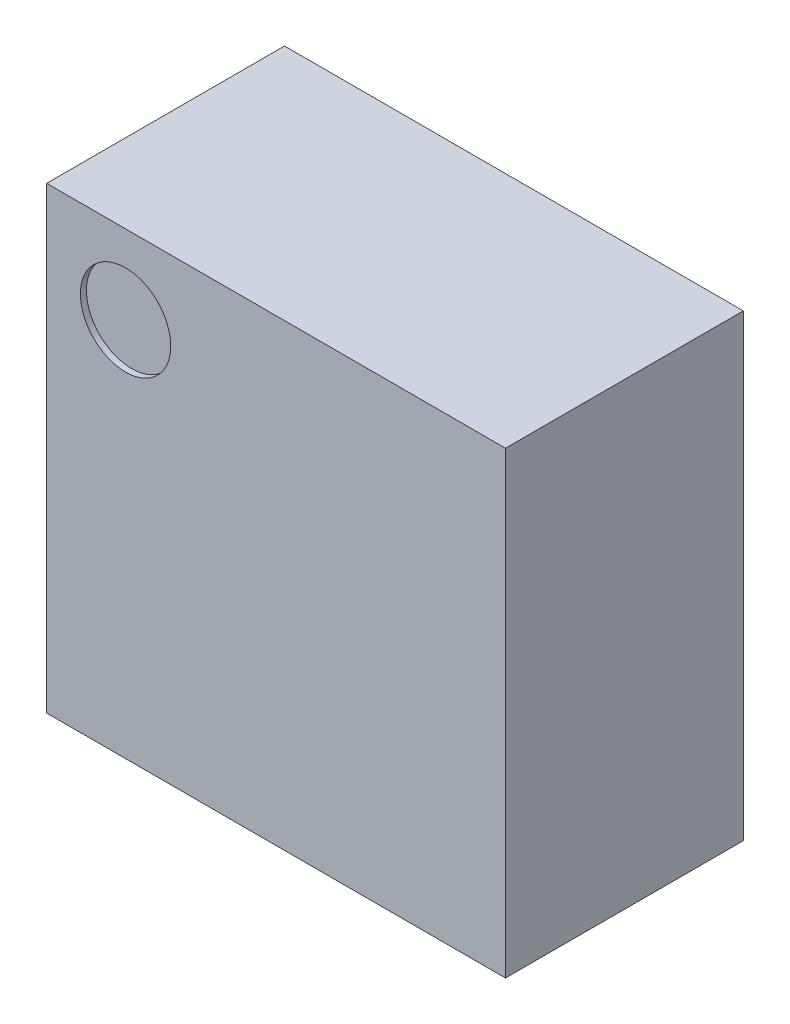
ISO-10303-21;
HEADER;
FILE_DESCRIPTION(('STEP AP214'),'2;1');
FILE_NAME('part.step','',(''),(''),'','','');
FILE_SCHEMA(('AUTOMOTIVE_DESIGN { 1 0 10303 214 1 1 1 1 }'));
ENDSEC;
DATA;
#1=APPLICATION_CONTEXT('core data for automotive mechanical design processes');
#2=APPLICATION_PROTOCOL_DEFINITION('international standard','automotive_design',2000,#1);
#3=PRODUCT_CONTEXT('',#1,'mechanical');
#4=PRODUCT('Part','Part','',(#3));
#5=PRODUCT_RELATED_PRODUCT_CATEGORY('part','',(#4));
#6=PRODUCT_DEFINITION_FORMATION('','',#4);
#7=PRODUCT_DEFINITION_CONTEXT('part definition',#1,'design');
#8=PRODUCT_DEFINITION('design','',#6,#7);
#9=PRODUCT_DEFINITION_SHAPE('','',#8);
#10=(LENGTH_UNIT() NAMED_UNIT(*) SI_UNIT(.MILLI.,.METRE.));
#11=(NAMED_UNIT(*) PLANE_ANGLE_UNIT() SI_UNIT($,.RADIAN.));
#12=(NAMED_UNIT(*) SI_UNIT($,.STERADIAN.) SOLID_ANGLE_UNIT());
#13=UNCERTAINTY_MEASURE_WITH_UNIT(LENGTH_MEASURE(1.E-05),#10,'distance_accuracy_value','');
#14=(GEOMETRIC_REPRESENTATION_CONTEXT(3) GLOBAL_UNCERTAINTY_ASSIGNED_CONTEXT((#13)) GLOBAL_UNIT_ASSIGNED_CONTEXT((#10,
#11,#12)) REPRESENTATION_CONTEXT('',''));
#15=CARTESIAN_POINT('',(0.,0.,0.));
#16=DIRECTION('',(0.,0.,1.));
#17=DIRECTION('',(1.,0.,0.));
#18=AXIS2_PLACEMENT_3D('',#15,#16,#17);
#19=CARTESIAN_POINT('',(0.,0.,0.53875000000102));
#20=DIRECTION('',(0.,0.,1.));
#21=DIRECTION('',(1.,0.,0.));
#22=AXIS2_PLACEMENT_3D('',#19,#20,#21);
#23=PLANE('',#22);
#24=CARTESIAN_POINT('',(-0.249999999999991,0.249999999999991,0.53875000000102));
#25=DIRECTION('',(0.,0.,1.));
#26=DIRECTION('',(1.,0.,0.));
#27=AXIS2_PLACEMENT_3D('',#24,#25,#26);
#28=CIRCLE('',#27,0.0750000000000048);
#29=CARTESIAN_POINT('',(-0.174999999999986,0.249999999999991,0.53875000000102));
#30=VERTEX_POINT('',#29);
#31=EDGE_CURVE('E20',#30,#30,#28,.T.);
#32=ORIENTED_EDGE('',*,*,#31,.T.);
#33=EDGE_LOOP('',(#32));
#34=FACE_BOUND('',#33,.T.);
#35=ADVANCED_FACE('F17',(#34),#23,.T.);
#36=CARTESIAN_POINT('',(-0.249999999999991,0.249999999999991,0.54875000000098));
#37=DIRECTION('',(0.,0.,1.));
#38=DIRECTION('',(1.,0.,0.));
#39=AXIS2_PLACEMENT_3D('',#36,#37,#38);
#40=CYLINDRICAL_SURFACE('',#39,0.0750000000000048);
#41=ORIENTED_EDGE('',*,*,#31,.F.);
#42=EDGE_LOOP('',(#41));
#43=FACE_BOUND('',#42,.T.);
#44=CARTESIAN_POINT('',(-0.249999999999991,0.249999999999991,0.54875000000098));
#45=DIRECTION('',(0.,0.,1.));
#46=DIRECTION('',(1.,0.,0.));
#47=AXIS2_PLACEMENT_3D('',#44,#45,#46);
#48=CIRCLE('',#47,0.0750000000000048);
#49=CARTESIAN_POINT('',(-0.174999999999986,0.249999999999991,0.54875000000098));
#50=VERTEX_POINT('',#49);
#51=EDGE_CURVE('E75',#50,#50,#48,.F.);
#52=ORIENTED_EDGE('',*,*,#51,.F.);
#53=EDGE_LOOP('',(#52));
#54=FACE_BOUND('',#53,.T.);
#55=ADVANCED_FACE('F90',(#43,#54),#40,.F.);
#56=CARTESIAN_POINT('',(0.,0.,0.54875000000098));
#57=DIRECTION('',(0.,0.,1.));
#58=DIRECTION('',(1.,0.,0.));
#59=AXIS2_PLACEMENT_3D('',#56,#57,#58);
#60=PLANE('',#59);
#61=ORIENTED_EDGE('',*,*,#51,.T.);
#62=EDGE_LOOP('',(#61));
#63=FACE_BOUND('',#62,.T.);
#64=DIRECTION('',(1.,0.,0.));
#65=VECTOR('',#64,1.);
#66=CARTESIAN_POINT('',(0.381,0.381,0.54875000000098));
#67=LINE('',#66,#65);
#68=CARTESIAN_POINT('',(-0.381,0.381,0.54875000000098));
#69=VERTEX_POINT('',#68);
#70=CARTESIAN_POINT('',(0.381,0.381,0.54875000000098));
#71=VERTEX_POINT('',#70);
#72=EDGE_CURVE('E71',#69,#71,#67,.T.);
#73=ORIENTED_EDGE('',*,*,#72,.F.);
#74=DIRECTION('',(0.,1.,0.));
#75=VECTOR('',#74,1.);
#76=CARTESIAN_POINT('',(-0.381,0.381,0.54875000000098));
#77=LINE('',#76,#75);
#78=CARTESIAN_POINT('',(-0.381,-0.381,0.54875000000098));
#79=VERTEX_POINT('',#78);
#80=EDGE_CURVE('E67',#79,#69,#77,.T.);
#81=ORIENTED_EDGE('',*,*,#80,.F.);
#82=DIRECTION('',(1.,0.,0.));
#83=VECTOR('',#82,1.);
#84=CARTESIAN_POINT('',(-0.381,-0.381,0.54875000000098));
#85=LINE('',#84,#83);
#86=CARTESIAN_POINT('',(0.381,-0.381,0.54875000000098));
#87=VERTEX_POINT('',#86);
#88=EDGE_CURVE('E58',#87,#79,#85,.F.);
#89=ORIENTED_EDGE('',*,*,#88,.F.);
#90=DIRECTION('',(0.,1.,0.));
#91=VECTOR('',#90,1.);
#92=CARTESIAN_POINT('',(0.381,-0.381,0.54875000000098));
#93=LINE('',#92,#91);
#94=EDGE_CURVE('E53',#71,#87,#93,.F.);
#95=ORIENTED_EDGE('',*,*,#94,.F.);
#96=EDGE_LOOP('',(#73,#81,#89,#95));
#97=FACE_BOUND('',#96,.T.);
#98=ADVANCED_FACE('F70',(#63,#97),#60,.T.);
#99=CARTESIAN_POINT('',(-0.381,0.381,0.));
#100=DIRECTION('',(-1.,0.,0.));
#101=DIRECTION('',(0.,0.,1.));
#102=AXIS2_PLACEMENT_3D('',#99,#100,#101);
#103=PLANE('',#102);
#104=DIRECTION('',(0.,0.,1.));
#105=VECTOR('',#104,1.);
#106=CARTESIAN_POINT('',(-0.381,0.381,0.));
#107=LINE('',#106,#105);
#108=CARTESIAN_POINT('',(-0.381,0.381,0.15375000000002));
#109=VERTEX_POINT('',#108);
#110=EDGE_CURVE('E186',#109,#69,#107,.T.);
#111=ORIENTED_EDGE('',*,*,#110,.F.);
#112=DIRECTION('',(0.,1.,0.));
#113=VECTOR('',#112,1.);
#114=CARTESIAN_POINT('',(-0.381,0.,0.15375000000002));
#115=LINE('',#114,#113);
#116=CARTESIAN_POINT('',(-0.381,-0.381,0.15375000000002));
#117=VERTEX_POINT('',#116);
#118=EDGE_CURVE('E79',#109,#117,#115,.F.);
#119=ORIENTED_EDGE('',*,*,#118,.T.);
#120=DIRECTION('',(0.,0.,-1.));
#121=VECTOR('',#120,1.);
#122=CARTESIAN_POINT('',(-0.381,-0.381,0.));
#123=LINE('',#122,#121);
#124=EDGE_CURVE('E63',#79,#117,#123,.T.);
#125=ORIENTED_EDGE('',*,*,#124,.F.);
#126=ORIENTED_EDGE('',*,*,#80,.T.);
#127=EDGE_LOOP('',(#111,#119,#125,#126));
#128=FACE_BOUND('',#127,.T.);
#129=ADVANCED_FACE('F78',(#128),#103,.T.);
#130=CARTESIAN_POINT('',(-0.381,-0.381,0.));
#131=DIRECTION('',(0.,-1.,0.));
#132=DIRECTION('',(0.,0.,-1.));
#133=AXIS2_PLACEMENT_3D('',#130,#131,#132);
#134=PLANE('',#133);
#135=ORIENTED_EDGE('',*,*,#124,.T.);
#136=DIRECTION('',(1.,0.,0.));
#137=VECTOR('',#136,1.);
#138=CARTESIAN_POINT('',(0.,-0.381,0.15375000000002));
#139=LINE('',#138,#137);
#140=CARTESIAN_POINT('',(0.381,-0.381,0.15375000000002));
#141=VERTEX_POINT('',#140);
#142=EDGE_CURVE('E187',#117,#141,#139,.T.);
#143=ORIENTED_EDGE('',*,*,#142,.T.);
#144=DIRECTION('',(0.,0.,-1.));
#145=VECTOR('',#144,1.);
#146=CARTESIAN_POINT('',(0.381,-0.381,0.));
#147=LINE('',#146,#145);
#148=EDGE_CURVE('E65',#87,#141,#147,.T.);
#149=ORIENTED_EDGE('',*,*,#148,.F.);
#150=ORIENTED_EDGE('',*,*,#88,.T.);
#151=EDGE_LOOP('',(#135,#143,#149,#150));
#152=FACE_BOUND('',#151,.T.);
#153=ADVANCED_FACE('F60',(#152),#134,.T.);
#154=CARTESIAN_POINT('',(0.381,-0.381,0.));
#155=DIRECTION('',(1.,0.,0.));
#156=DIRECTION('',(0.,0.,-1.));
#157=AXIS2_PLACEMENT_3D('',#154,#155,#156);
#158=PLANE('',#157);
#159=ORIENTED_EDGE('',*,*,#148,.T.);
#160=DIRECTION('',(0.,1.,0.));
#161=VECTOR('',#160,1.);
#162=CARTESIAN_POINT('',(0.381,0.,0.15375000000002));
#163=LINE('',#162,#161);
#164=CARTESIAN_POINT('',(0.381,0.381,0.15375000000002));
#165=VERTEX_POINT('',#164);
#166=EDGE_CURVE('E26',#141,#165,#163,.T.);
#167=ORIENTED_EDGE('',*,*,#166,.T.);
#168=DIRECTION('',(0.,0.,1.));
#169=VECTOR('',#168,1.);
#170=CARTESIAN_POINT('',(0.381,0.381,0.));
#171=LINE('',#170,#169);
#172=EDGE_CURVE('E34',#71,#165,#171,.F.);
#173=ORIENTED_EDGE('',*,*,#172,.F.);
#174=ORIENTED_EDGE('',*,*,#94,.T.);
#175=EDGE_LOOP('',(#159,#167,#173,#174));
#176=FACE_BOUND('',#175,.T.);
#177=ADVANCED_FACE('F107',(#176),#158,.T.);
#178=CARTESIAN_POINT('',(0.381,0.381,0.));
#179=DIRECTION('',(0.,1.,0.));
#180=DIRECTION('',(0.,0.,1.));
#181=AXIS2_PLACEMENT_3D('',#178,#179,#180);
#182=PLANE('',#181);
#183=ORIENTED_EDGE('',*,*,#172,.T.);
#184=DIRECTION('',(1.,0.,0.));
#185=VECTOR('',#184,1.);
#186=CARTESIAN_POINT('',(0.,0.381,0.15375000000002));
#187=LINE('',#186,#185);
#188=EDGE_CURVE('E11',#165,#109,#187,.F.);
#189=ORIENTED_EDGE('',*,*,#188,.T.);
#190=ORIENTED_EDGE('',*,*,#110,.T.);
#191=ORIENTED_EDGE('',*,*,#72,.T.);
#192=EDGE_LOOP('',(#183,#189,#190,#191));
#193=FACE_BOUND('',#192,.T.);
#194=ADVANCED_FACE('F101',(#193),#182,.T.);
#195=CARTESIAN_POINT('',(0.,0.,0.15375000000002));
#196=DIRECTION('',(0.,0.,1.));
#197=DIRECTION('',(1.,0.,0.));
#198=AXIS2_PLACEMENT_3D('',#195,#196,#197);
#199=PLANE('',#198);
#200=ORIENTED_EDGE('',*,*,#166,.F.);
#201=ORIENTED_EDGE('',*,*,#142,.F.);
#202=ORIENTED_EDGE('',*,*,#118,.F.);
#203=ORIENTED_EDGE('',*,*,#188,.F.);
#204=EDGE_LOOP('',(#200,#201,#202,#203));
#205=FACE_BOUND('',#204,.T.);
#206=ADVANCED_FACE('F99',(#205),#199,.F.);
#207=CLOSED_SHELL('',(#35,#55,#98,#129,#153,#177,#194,#206));
#208=MANIFOLD_SOLID_BREP('B1',#207);
#209=ADVANCED_BREP_SHAPE_REPRESENTATION('',(#18,#208),#14);
#210=SHAPE_DEFINITION_REPRESENTATION(#9,#209);
ENDSEC;
END-ISO-10303-21;
